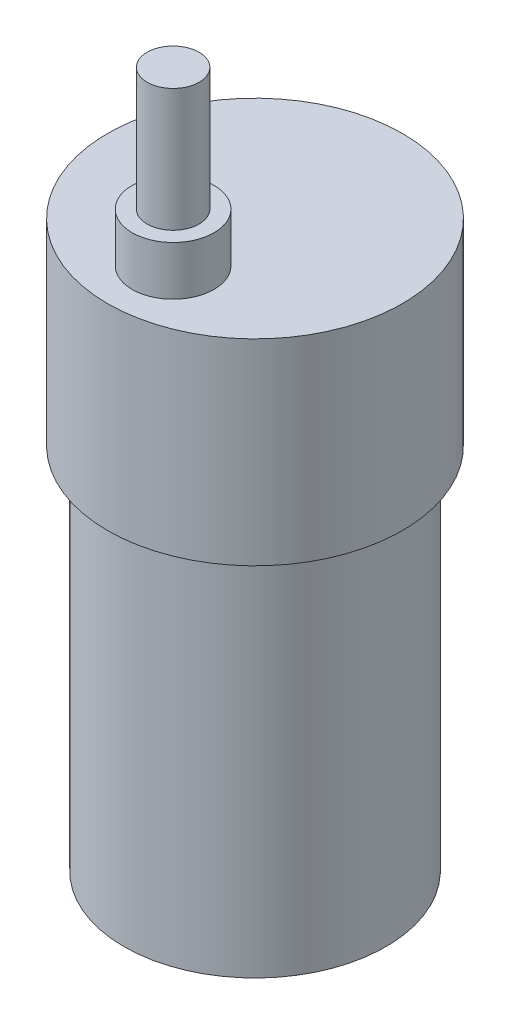
ISO-10303-21;
HEADER;
FILE_DESCRIPTION(('STEP AP214'),'2;1');
FILE_NAME('part.step','',(''),(''),'','','');
FILE_SCHEMA(('AUTOMOTIVE_DESIGN { 1 0 10303 214 1 1 1 1 }'));
ENDSEC;
DATA;
#1=APPLICATION_CONTEXT('core data for automotive mechanical design processes');
#2=APPLICATION_PROTOCOL_DEFINITION('international standard','automotive_design',2000,#1);
#3=PRODUCT_CONTEXT('',#1,'mechanical');
#4=PRODUCT('Part','Part','',(#3));
#5=PRODUCT_RELATED_PRODUCT_CATEGORY('part','',(#4));
#6=PRODUCT_DEFINITION_FORMATION('','',#4);
#7=PRODUCT_DEFINITION_CONTEXT('part definition',#1,'design');
#8=PRODUCT_DEFINITION('design','',#6,#7);
#9=PRODUCT_DEFINITION_SHAPE('','',#8);
#10=(LENGTH_UNIT() NAMED_UNIT(*) SI_UNIT(.MILLI.,.METRE.));
#11=(NAMED_UNIT(*) PLANE_ANGLE_UNIT() SI_UNIT($,.RADIAN.));
#12=(NAMED_UNIT(*) SI_UNIT($,.STERADIAN.) SOLID_ANGLE_UNIT());
#13=UNCERTAINTY_MEASURE_WITH_UNIT(LENGTH_MEASURE(1.E-05),#10,'distance_accuracy_value','');
#14=(GEOMETRIC_REPRESENTATION_CONTEXT(3) GLOBAL_UNCERTAINTY_ASSIGNED_CONTEXT((#13)) GLOBAL_UNIT_ASSIGNED_CONTEXT((#10,
#11,#12)) REPRESENTATION_CONTEXT('',''));
#15=CARTESIAN_POINT('',(0.,0.,0.));
#16=DIRECTION('',(0.,0.,1.));
#17=DIRECTION('',(1.,0.,0.));
#18=AXIS2_PLACEMENT_3D('',#15,#16,#17);
#19=CARTESIAN_POINT('',(0.,45.,0.));
#20=DIRECTION('',(0.,-1.,0.));
#21=DIRECTION('',(0.,0.,-1.));
#22=AXIS2_PLACEMENT_3D('',#19,#20,#21);
#23=CYLINDRICAL_SURFACE('',#22,16.);
#24=CARTESIAN_POINT('',(0.,45.,0.));
#25=DIRECTION('',(0.,1.,0.));
#26=DIRECTION('',(0.,0.,1.));
#27=AXIS2_PLACEMENT_3D('',#24,#25,#26);
#28=CIRCLE('',#27,16.);
#29=CARTESIAN_POINT('',(0.,45.,-16.));
#30=VERTEX_POINT('',#29);
#31=EDGE_CURVE('E10',#30,#30,#28,.T.);
#32=CARTESIAN_POINT('',(0.,0.,0.));
#33=DIRECTION('',(0.,1.,0.));
#34=DIRECTION('',(0.,0.,1.));
#35=AXIS2_PLACEMENT_3D('',#32,#33,#34);
#36=CIRCLE('',#35,16.);
#37=CARTESIAN_POINT('',(0.,0.,-16.));
#38=VERTEX_POINT('',#37);
#39=EDGE_CURVE('E44',#38,#38,#36,.T.);
#40=CARTESIAN_POINT('',(0.,45.,-16.));
#41=CARTESIAN_POINT('',(0.,44.53125,-16.));
#42=CARTESIAN_POINT('',(0.,44.0625,-16.));
#43=CARTESIAN_POINT('',(0.,43.125,-16.));
#44=CARTESIAN_POINT('',(0.,42.65625,-16.));
#45=CARTESIAN_POINT('',(0.,41.71875,-16.));
#46=CARTESIAN_POINT('',(0.,41.25,-16.));
#47=CARTESIAN_POINT('',(0.,40.3125,-16.));
#48=CARTESIAN_POINT('',(0.,39.84375,-16.));
#49=CARTESIAN_POINT('',(0.,38.90625,-16.));
#50=CARTESIAN_POINT('',(0.,38.4375,-16.));
#51=CARTESIAN_POINT('',(0.,37.5,-16.));
#52=CARTESIAN_POINT('',(0.,37.03125,-16.));
#53=CARTESIAN_POINT('',(0.,36.09375,-16.));
#54=CARTESIAN_POINT('',(0.,35.625,-16.));
#55=CARTESIAN_POINT('',(0.,34.6875,-16.));
#56=CARTESIAN_POINT('',(0.,34.21875,-16.));
#57=CARTESIAN_POINT('',(0.,33.28125,-16.));
#58=CARTESIAN_POINT('',(0.,32.8125,-16.));
#59=CARTESIAN_POINT('',(0.,31.875,-16.));
#60=CARTESIAN_POINT('',(0.,31.40625,-16.));
#61=CARTESIAN_POINT('',(0.,30.46875,-16.));
#62=CARTESIAN_POINT('',(0.,30.,-16.));
#63=CARTESIAN_POINT('',(0.,29.0625,-16.));
#64=CARTESIAN_POINT('',(0.,28.59375,-16.));
#65=CARTESIAN_POINT('',(0.,27.65625,-16.));
#66=CARTESIAN_POINT('',(0.,27.1875,-16.));
#67=CARTESIAN_POINT('',(0.,26.25,-16.));
#68=CARTESIAN_POINT('',(0.,25.78125,-16.));
#69=CARTESIAN_POINT('',(0.,24.84375,-16.));
#70=CARTESIAN_POINT('',(0.,24.375,-16.));
#71=CARTESIAN_POINT('',(0.,23.4375,-16.));
#72=CARTESIAN_POINT('',(0.,22.96875,-16.));
#73=CARTESIAN_POINT('',(0.,22.03125,-16.));
#74=CARTESIAN_POINT('',(0.,21.5625,-16.));
#75=CARTESIAN_POINT('',(0.,20.625,-16.));
#76=CARTESIAN_POINT('',(0.,20.15625,-16.));
#77=CARTESIAN_POINT('',(0.,19.21875,-16.));
#78=CARTESIAN_POINT('',(0.,18.75,-16.));
#79=CARTESIAN_POINT('',(0.,17.8125,-16.));
#80=CARTESIAN_POINT('',(0.,17.34375,-16.));
#81=CARTESIAN_POINT('',(0.,16.40625,-16.));
#82=CARTESIAN_POINT('',(0.,15.9375,-16.));
#83=CARTESIAN_POINT('',(0.,15.,-16.));
#84=CARTESIAN_POINT('',(0.,14.53125,-16.));
#85=CARTESIAN_POINT('',(0.,13.59375,-16.));
#86=CARTESIAN_POINT('',(0.,13.125,-16.));
#87=CARTESIAN_POINT('',(0.,12.1875,-16.));
#88=CARTESIAN_POINT('',(0.,11.71875,-16.));
#89=CARTESIAN_POINT('',(0.,10.78125,-16.));
#90=CARTESIAN_POINT('',(0.,10.3125,-16.));
#91=CARTESIAN_POINT('',(0.,9.375,-16.));
#92=CARTESIAN_POINT('',(0.,8.90625,-16.));
#93=CARTESIAN_POINT('',(0.,7.96874999999999,-16.));
#94=CARTESIAN_POINT('',(0.,7.5,-16.));
#95=CARTESIAN_POINT('',(0.,6.5625,-16.));
#96=CARTESIAN_POINT('',(0.,6.09375,-16.));
#97=CARTESIAN_POINT('',(0.,5.15625,-16.));
#98=CARTESIAN_POINT('',(0.,4.68749999999999,-16.));
#99=CARTESIAN_POINT('',(0.,3.74999999999999,-16.));
#100=CARTESIAN_POINT('',(0.,3.28124999999999,-16.));
#101=CARTESIAN_POINT('',(0.,2.34374999999999,-16.));
#102=CARTESIAN_POINT('',(0.,1.87499999999999,-16.));
#103=CARTESIAN_POINT('',(0.,0.937499999999992,-16.));
#104=CARTESIAN_POINT('',(0.,0.468749999999993,-16.));
#105=CARTESIAN_POINT('',(0.,0.,-16.));
#106=B_SPLINE_CURVE_WITH_KNOTS('',3,(#40,#41,#42,#43,#44,#45,#46,#47,#48,#49,#50,#51,#52,#53,
#54,#55,#56,#57,#58,#59,#60,#61,#62,#63,#64,#65,#66,#67,#68,#69,#70,#71,#72,#73,#74,#75,#76,#77,
#78,#79,#80,#81,#82,#83,#84,#85,#86,#87,#88,#89,#90,#91,#92,#93,#94,#95,#96,#97,#98,#99,#100,
#101,#102,#103,#104,#105),.UNSPECIFIED.,.F.,.F.,(4,2,2,2,2,2,2,2,2,2,2,2,2,2,2,2,2,2,2,2,2,2,2,
2,2,2,2,2,2,2,2,2,4),(0.,1.40625,2.8125,4.21875000000001,5.62500000000001,7.03125,8.4375,
9.84375000000001,11.25,12.65625,14.0625,15.46875,16.875,18.28125,19.6875,21.09375,22.5,23.90625,
25.3125,26.71875,28.125,29.53125,30.9375,32.34375,33.75,35.15625,36.5625,37.96875,39.375,
40.78125,42.1875,43.59375,45.),.UNSPECIFIED.);
#107=EDGE_CURVE('BSEAM41',#30,#38,#106,.T.);
#108=ORIENTED_EDGE('',*,*,#31,.F.);
#109=ORIENTED_EDGE('',*,*,#39,.T.);
#110=ORIENTED_EDGE('',*,*,#107,.T.);
#111=ORIENTED_EDGE('',*,*,#107,.F.);
#112=EDGE_LOOP('',(#108,#110,#109,#111));
#113=FACE_BOUND('',#112,.T.);
#114=ADVANCED_FACE('F41',(#113),#23,.T.);
#115=CARTESIAN_POINT('',(0.,0.,0.));
#116=DIRECTION('',(0.,1.,0.));
#117=DIRECTION('',(0.,0.,1.));
#118=AXIS2_PLACEMENT_3D('',#115,#116,#117);
#119=PLANE('',#118);
#120=ORIENTED_EDGE('',*,*,#39,.F.);
#121=EDGE_LOOP('',(#120));
#122=FACE_BOUND('',#121,.T.);
#123=ADVANCED_FACE('F96',(#122),#119,.F.);
#124=CARTESIAN_POINT('',(0.,69.,0.));
#125=DIRECTION('',(0.,-1.,0.));
#126=DIRECTION('',(0.,0.,-1.));
#127=AXIS2_PLACEMENT_3D('',#124,#125,#126);
#128=CYLINDRICAL_SURFACE('',#127,18.);
#129=CARTESIAN_POINT('',(0.,69.,0.));
#130=DIRECTION('',(0.,1.,0.));
#131=DIRECTION('',(0.,0.,1.));
#132=AXIS2_PLACEMENT_3D('',#129,#130,#131);
#133=CIRCLE('',#132,18.);
#134=CARTESIAN_POINT('',(0.,69.,18.));
#135=VERTEX_POINT('',#134);
#136=EDGE_CURVE('E53',#135,#135,#133,.T.);
#137=ORIENTED_EDGE('',*,*,#136,.F.);
#138=EDGE_LOOP('',(#137));
#139=FACE_BOUND('',#138,.T.);
#140=CARTESIAN_POINT('',(0.,45.,0.));
#141=DIRECTION('',(0.,1.,0.));
#142=DIRECTION('',(0.,0.,1.));
#143=AXIS2_PLACEMENT_3D('',#140,#141,#142);
#144=CIRCLE('',#143,18.);
#145=CARTESIAN_POINT('',(0.,45.,18.));
#146=VERTEX_POINT('',#145);
#147=EDGE_CURVE('E55',#146,#146,#144,.T.);
#148=ORIENTED_EDGE('',*,*,#147,.T.);
#149=EDGE_LOOP('',(#148));
#150=FACE_BOUND('',#149,.T.);
#151=ADVANCED_FACE('F101',(#139,#150),#128,.T.);
#152=CARTESIAN_POINT('',(0.,69.,0.));
#153=DIRECTION('',(0.,1.,0.));
#154=DIRECTION('',(0.,0.,1.));
#155=AXIS2_PLACEMENT_3D('',#152,#153,#154);
#156=PLANE('',#155);
#157=CARTESIAN_POINT('',(0.,69.,10.));
#158=DIRECTION('',(0.,1.,0.));
#159=DIRECTION('',(0.,0.,1.));
#160=AXIS2_PLACEMENT_3D('',#157,#158,#159);
#161=CIRCLE('',#160,5.);
#162=CARTESIAN_POINT('',(0.,69.,15.));
#163=VERTEX_POINT('',#162);
#164=EDGE_CURVE('E63',#163,#163,#161,.T.);
#165=ORIENTED_EDGE('',*,*,#164,.F.);
#166=EDGE_LOOP('',(#165));
#167=FACE_BOUND('',#166,.T.);
#168=ORIENTED_EDGE('',*,*,#136,.T.);
#169=EDGE_LOOP('',(#168));
#170=FACE_BOUND('',#169,.T.);
#171=ADVANCED_FACE('F108',(#167,#170),#156,.T.);
#172=CARTESIAN_POINT('',(0.,45.,0.));
#173=DIRECTION('',(0.,1.,0.));
#174=DIRECTION('',(0.,0.,1.));
#175=AXIS2_PLACEMENT_3D('',#172,#173,#174);
#176=PLANE('',#175);
#177=ORIENTED_EDGE('',*,*,#31,.T.);
#178=EDGE_LOOP('',(#177));
#179=FACE_BOUND('',#178,.T.);
#180=ORIENTED_EDGE('',*,*,#147,.F.);
#181=EDGE_LOOP('',(#180));
#182=FACE_BOUND('',#181,.T.);
#183=ADVANCED_FACE('F112',(#179,#182),#176,.F.);
#184=CARTESIAN_POINT('',(0.,75.,10.));
#185=DIRECTION('',(0.,1.,0.));
#186=DIRECTION('',(0.,0.,1.));
#187=AXIS2_PLACEMENT_3D('',#184,#185,#186);
#188=PLANE('',#187);
#189=CARTESIAN_POINT('',(0.,75.,10.));
#190=DIRECTION('',(0.,1.,0.));
#191=DIRECTION('',(0.,0.,1.));
#192=AXIS2_PLACEMENT_3D('',#189,#190,#191);
#193=CIRCLE('',#192,5.);
#194=CARTESIAN_POINT('',(0.,75.,15.));
#195=VERTEX_POINT('',#194);
#196=EDGE_CURVE('E59',#195,#195,#193,.T.);
#197=ORIENTED_EDGE('',*,*,#196,.T.);
#198=EDGE_LOOP('',(#197));
#199=FACE_BOUND('',#198,.T.);
#200=CARTESIAN_POINT('',(0.,75.,10.));
#201=DIRECTION('',(0.,1.,0.));
#202=DIRECTION('',(0.,0.,1.));
#203=AXIS2_PLACEMENT_3D('',#200,#201,#202);
#204=CIRCLE('',#203,3.175);
#205=CARTESIAN_POINT('',(0.,75.,13.175));
#206=VERTEX_POINT('',#205);
#207=EDGE_CURVE('E67',#206,#206,#204,.T.);
#208=ORIENTED_EDGE('',*,*,#207,.F.);
#209=EDGE_LOOP('',(#208));
#210=FACE_BOUND('',#209,.T.);
#211=ADVANCED_FACE('F91',(#199,#210),#188,.T.);
#212=CARTESIAN_POINT('',(0.,75.,10.));
#213=DIRECTION('',(0.,-1.,0.));
#214=DIRECTION('',(0.,0.,-1.));
#215=AXIS2_PLACEMENT_3D('',#212,#213,#214);
#216=CYLINDRICAL_SURFACE('',#215,5.);
#217=ORIENTED_EDGE('',*,*,#196,.F.);
#218=EDGE_LOOP('',(#217));
#219=FACE_BOUND('',#218,.T.);
#220=ORIENTED_EDGE('',*,*,#164,.T.);
#221=EDGE_LOOP('',(#220));
#222=FACE_BOUND('',#221,.T.);
#223=ADVANCED_FACE('F83',(#219,#222),#216,.T.);
#224=CARTESIAN_POINT('',(0.,61.38,10.));
#225=DIRECTION('',(0.,1.,0.));
#226=DIRECTION('',(0.,0.,1.));
#227=AXIS2_PLACEMENT_3D('',#224,#225,#226);
#228=CYLINDRICAL_SURFACE('',#227,3.175);
#229=ORIENTED_EDGE('',*,*,#207,.T.);
#230=EDGE_LOOP('',(#229));
#231=FACE_BOUND('',#230,.T.);
#232=CARTESIAN_POINT('',(0.,90.,10.));
#233=DIRECTION('',(0.,1.,0.));
#234=DIRECTION('',(0.,0.,1.));
#235=AXIS2_PLACEMENT_3D('',#232,#233,#234);
#236=CIRCLE('',#235,3.175);
#237=CARTESIAN_POINT('',(0.,90.,13.175));
#238=VERTEX_POINT('',#237);
#239=EDGE_CURVE('E74',#238,#238,#236,.T.);
#240=ORIENTED_EDGE('',*,*,#239,.F.);
#241=EDGE_LOOP('',(#240));
#242=FACE_BOUND('',#241,.T.);
#243=ADVANCED_FACE('F81',(#231,#242),#228,.T.);
#244=CARTESIAN_POINT('',(0.,90.,10.));
#245=DIRECTION('',(0.,1.,0.));
#246=DIRECTION('',(0.,0.,1.));
#247=AXIS2_PLACEMENT_3D('',#244,#245,#246);
#248=PLANE('',#247);
#249=ORIENTED_EDGE('',*,*,#239,.T.);
#250=EDGE_LOOP('',(#249));
#251=FACE_BOUND('',#250,.T.);
#252=ADVANCED_FACE('F79',(#251),#248,.T.);
#253=CLOSED_SHELL('',(#114,#123,#151,#171,#183,#211,#223,#243,#252));
#254=MANIFOLD_SOLID_BREP('B2',#253);
#255=ADVANCED_BREP_SHAPE_REPRESENTATION('',(#18,#254),#14);
#256=SHAPE_DEFINITION_REPRESENTATION(#9,#255);
ENDSEC;
END-ISO-10303-21;
